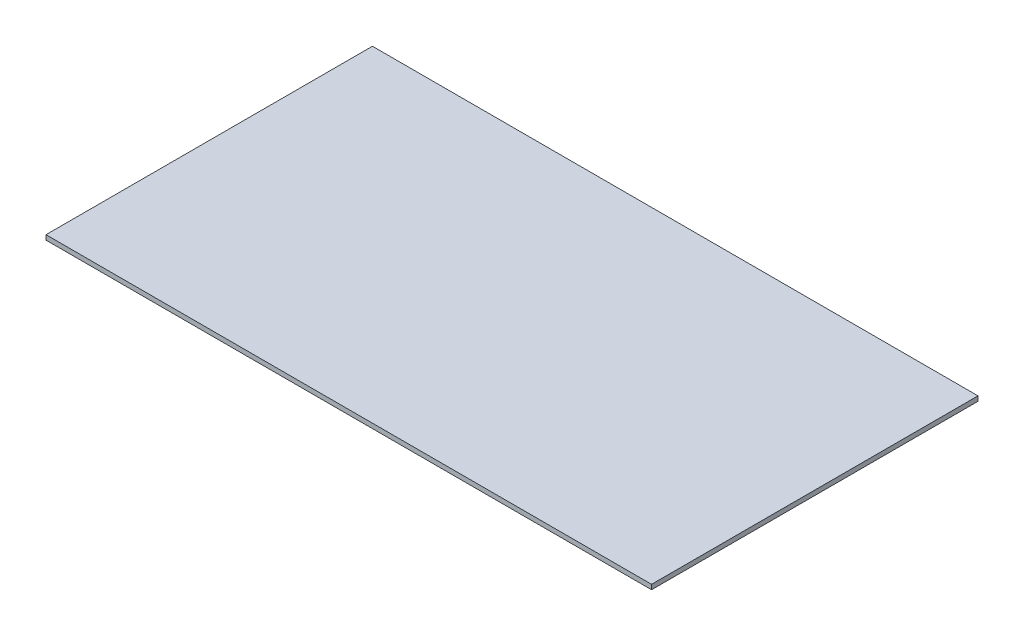
ISO-10303-21;
HEADER;
FILE_DESCRIPTION(('STEP AP214'),'2;1');
FILE_NAME('part.step','',(''),(''),'','','');
FILE_SCHEMA(('AUTOMOTIVE_DESIGN { 1 0 10303 214 1 1 1 1 }'));
ENDSEC;
DATA;
#1=APPLICATION_CONTEXT('core data for automotive mechanical design processes');
#2=APPLICATION_PROTOCOL_DEFINITION('international standard','automotive_design',2000,#1);
#3=PRODUCT_CONTEXT('',#1,'mechanical');
#4=PRODUCT('Part','Part','',(#3));
#5=PRODUCT_RELATED_PRODUCT_CATEGORY('part','',(#4));
#6=PRODUCT_DEFINITION_FORMATION('','',#4);
#7=PRODUCT_DEFINITION_CONTEXT('part definition',#1,'design');
#8=PRODUCT_DEFINITION('design','',#6,#7);
#9=PRODUCT_DEFINITION_SHAPE('','',#8);
#10=(LENGTH_UNIT() NAMED_UNIT(*) SI_UNIT(.MILLI.,.METRE.));
#11=(NAMED_UNIT(*) PLANE_ANGLE_UNIT() SI_UNIT($,.RADIAN.));
#12=(NAMED_UNIT(*) SI_UNIT($,.STERADIAN.) SOLID_ANGLE_UNIT());
#13=UNCERTAINTY_MEASURE_WITH_UNIT(LENGTH_MEASURE(1.E-05),#10,'distance_accuracy_value','');
#14=(GEOMETRIC_REPRESENTATION_CONTEXT(3) GLOBAL_UNCERTAINTY_ASSIGNED_CONTEXT((#13)) GLOBAL_UNIT_ASSIGNED_CONTEXT((#10,
#11,#12)) REPRESENTATION_CONTEXT('',''));
#15=CARTESIAN_POINT('',(0.,0.,0.));
#16=DIRECTION('',(0.,0.,1.));
#17=DIRECTION('',(1.,0.,0.));
#18=AXIS2_PLACEMENT_3D('',#15,#16,#17);
#19=CARTESIAN_POINT('',(0.,6.35,0.));
#20=DIRECTION('',(1.,0.,0.));
#21=DIRECTION('',(0.,0.,-1.));
#22=AXIS2_PLACEMENT_3D('',#19,#20,#21);
#23=PLANE('',#22);
#24=DIRECTION('',(0.,0.,1.));
#25=VECTOR('',#24,1.);
#26=CARTESIAN_POINT('',(0.,0.,0.));
#27=LINE('',#26,#25);
#28=CARTESIAN_POINT('',(0.,0.,-438.149999999999));
#29=VERTEX_POINT('',#28);
#30=CARTESIAN_POINT('',(0.,0.,0.));
#31=VERTEX_POINT('',#30);
#32=EDGE_CURVE('E96',#29,#31,#27,.T.);
#33=ORIENTED_EDGE('',*,*,#32,.T.);
#34=DIRECTION('',(0.,-1.,0.));
#35=VECTOR('',#34,1.);
#36=CARTESIAN_POINT('',(0.,6.35,0.));
#37=LINE('',#36,#35);
#38=CARTESIAN_POINT('',(0.,6.35,0.));
#39=VERTEX_POINT('',#38);
#40=EDGE_CURVE('E11',#39,#31,#37,.T.);
#41=ORIENTED_EDGE('',*,*,#40,.F.);
#42=DIRECTION('',(0.,0.,1.));
#43=VECTOR('',#42,1.);
#44=CARTESIAN_POINT('',(0.,6.35,0.));
#45=LINE('',#44,#43);
#46=CARTESIAN_POINT('',(0.,6.35,-438.149999999999));
#47=VERTEX_POINT('',#46);
#48=EDGE_CURVE('E84',#47,#39,#45,.T.);
#49=ORIENTED_EDGE('',*,*,#48,.F.);
#50=DIRECTION('',(0.,-1.,0.));
#51=VECTOR('',#50,1.);
#52=CARTESIAN_POINT('',(0.,6.35,-438.149999999999));
#53=LINE('',#52,#51);
#54=EDGE_CURVE('E92',#47,#29,#53,.T.);
#55=ORIENTED_EDGE('',*,*,#54,.T.);
#56=EDGE_LOOP('',(#33,#41,#49,#55));
#57=FACE_BOUND('',#56,.T.);
#58=ADVANCED_FACE('F33',(#57),#23,.F.);
#59=CARTESIAN_POINT('',(0.,6.35,0.));
#60=DIRECTION('',(0.,0.,-1.));
#61=DIRECTION('',(-1.,0.,0.));
#62=AXIS2_PLACEMENT_3D('',#59,#60,#61);
#63=PLANE('',#62);
#64=DIRECTION('',(1.,0.,0.));
#65=VECTOR('',#64,1.);
#66=CARTESIAN_POINT('',(0.,0.,0.));
#67=LINE('',#66,#65);
#68=CARTESIAN_POINT('',(812.8,0.,0.));
#69=VERTEX_POINT('',#68);
#70=EDGE_CURVE('E88',#31,#69,#67,.T.);
#71=ORIENTED_EDGE('',*,*,#70,.T.);
#72=DIRECTION('',(0.,-1.,0.));
#73=VECTOR('',#72,1.);
#74=CARTESIAN_POINT('',(812.8,6.35,0.));
#75=LINE('',#74,#73);
#76=CARTESIAN_POINT('',(812.8,6.35,0.));
#77=VERTEX_POINT('',#76);
#78=EDGE_CURVE('E41',#77,#69,#75,.T.);
#79=ORIENTED_EDGE('',*,*,#78,.F.);
#80=DIRECTION('',(1.,0.,0.));
#81=VECTOR('',#80,1.);
#82=CARTESIAN_POINT('',(0.,6.35,0.));
#83=LINE('',#82,#81);
#84=EDGE_CURVE('E79',#39,#77,#83,.T.);
#85=ORIENTED_EDGE('',*,*,#84,.F.);
#86=ORIENTED_EDGE('',*,*,#40,.T.);
#87=EDGE_LOOP('',(#71,#79,#85,#86));
#88=FACE_BOUND('',#87,.T.);
#89=ADVANCED_FACE('F87',(#88),#63,.F.);
#90=CARTESIAN_POINT('',(812.8,6.35,0.));
#91=DIRECTION('',(-1.,0.,0.));
#92=DIRECTION('',(0.,0.,1.));
#93=AXIS2_PLACEMENT_3D('',#90,#91,#92);
#94=PLANE('',#93);
#95=DIRECTION('',(0.,0.,-1.));
#96=VECTOR('',#95,1.);
#97=CARTESIAN_POINT('',(812.8,0.,0.));
#98=LINE('',#97,#96);
#99=CARTESIAN_POINT('',(812.8,0.,-438.149999999999));
#100=VERTEX_POINT('',#99);
#101=EDGE_CURVE('E66',#69,#100,#98,.T.);
#102=ORIENTED_EDGE('',*,*,#101,.T.);
#103=DIRECTION('',(0.,-1.,0.));
#104=VECTOR('',#103,1.);
#105=CARTESIAN_POINT('',(812.8,6.35,-438.149999999999));
#106=LINE('',#105,#104);
#107=CARTESIAN_POINT('',(812.8,6.35,-438.149999999999));
#108=VERTEX_POINT('',#107);
#109=EDGE_CURVE('E89',#108,#100,#106,.T.);
#110=ORIENTED_EDGE('',*,*,#109,.F.);
#111=DIRECTION('',(0.,0.,-1.));
#112=VECTOR('',#111,1.);
#113=CARTESIAN_POINT('',(812.8,6.35,0.));
#114=LINE('',#113,#112);
#115=EDGE_CURVE('E82',#77,#108,#114,.T.);
#116=ORIENTED_EDGE('',*,*,#115,.F.);
#117=ORIENTED_EDGE('',*,*,#78,.T.);
#118=EDGE_LOOP('',(#102,#110,#116,#117));
#119=FACE_BOUND('',#118,.T.);
#120=ADVANCED_FACE('F90',(#119),#94,.F.);
#121=CARTESIAN_POINT('',(0.,6.35,-438.149999999999));
#122=DIRECTION('',(0.,0.,1.));
#123=DIRECTION('',(1.,0.,0.));
#124=AXIS2_PLACEMENT_3D('',#121,#122,#123);
#125=PLANE('',#124);
#126=DIRECTION('',(-1.,0.,0.));
#127=VECTOR('',#126,1.);
#128=CARTESIAN_POINT('',(0.,0.,-438.149999999999));
#129=LINE('',#128,#127);
#130=EDGE_CURVE('E72',#100,#29,#129,.T.);
#131=ORIENTED_EDGE('',*,*,#130,.T.);
#132=ORIENTED_EDGE('',*,*,#54,.F.);
#133=DIRECTION('',(-1.,0.,0.));
#134=VECTOR('',#133,1.);
#135=CARTESIAN_POINT('',(0.,6.35,-438.149999999999));
#136=LINE('',#135,#134);
#137=EDGE_CURVE('E49',#108,#47,#136,.T.);
#138=ORIENTED_EDGE('',*,*,#137,.F.);
#139=ORIENTED_EDGE('',*,*,#109,.T.);
#140=EDGE_LOOP('',(#131,#132,#138,#139));
#141=FACE_BOUND('',#140,.T.);
#142=ADVANCED_FACE('F103',(#141),#125,.F.);
#143=CARTESIAN_POINT('',(0.,6.35,0.));
#144=DIRECTION('',(0.,-1.,0.));
#145=DIRECTION('',(0.,0.,-1.));
#146=AXIS2_PLACEMENT_3D('',#143,#144,#145);
#147=PLANE('',#146);
#148=ORIENTED_EDGE('',*,*,#48,.T.);
#149=ORIENTED_EDGE('',*,*,#84,.T.);
#150=ORIENTED_EDGE('',*,*,#115,.T.);
#151=ORIENTED_EDGE('',*,*,#137,.T.);
#152=EDGE_LOOP('',(#148,#149,#150,#151));
#153=FACE_BOUND('',#152,.T.);
#154=ADVANCED_FACE('F80',(#153),#147,.F.);
#155=CARTESIAN_POINT('',(0.,0.,0.));
#156=DIRECTION('',(0.,-1.,0.));
#157=DIRECTION('',(0.,0.,-1.));
#158=AXIS2_PLACEMENT_3D('',#155,#156,#157);
#159=PLANE('',#158);
#160=ORIENTED_EDGE('',*,*,#32,.F.);
#161=ORIENTED_EDGE('',*,*,#130,.F.);
#162=ORIENTED_EDGE('',*,*,#101,.F.);
#163=ORIENTED_EDGE('',*,*,#70,.F.);
#164=EDGE_LOOP('',(#160,#161,#162,#163));
#165=FACE_BOUND('',#164,.T.);
#166=ADVANCED_FACE('F106',(#165),#159,.T.);
#167=CLOSED_SHELL('',(#58,#89,#120,#142,#154,#166));
#168=MANIFOLD_SOLID_BREP('B2',#167);
#169=ADVANCED_BREP_SHAPE_REPRESENTATION('',(#18,#168),#14);
#170=SHAPE_DEFINITION_REPRESENTATION(#9,#169);
ENDSEC;
END-ISO-10303-21;
